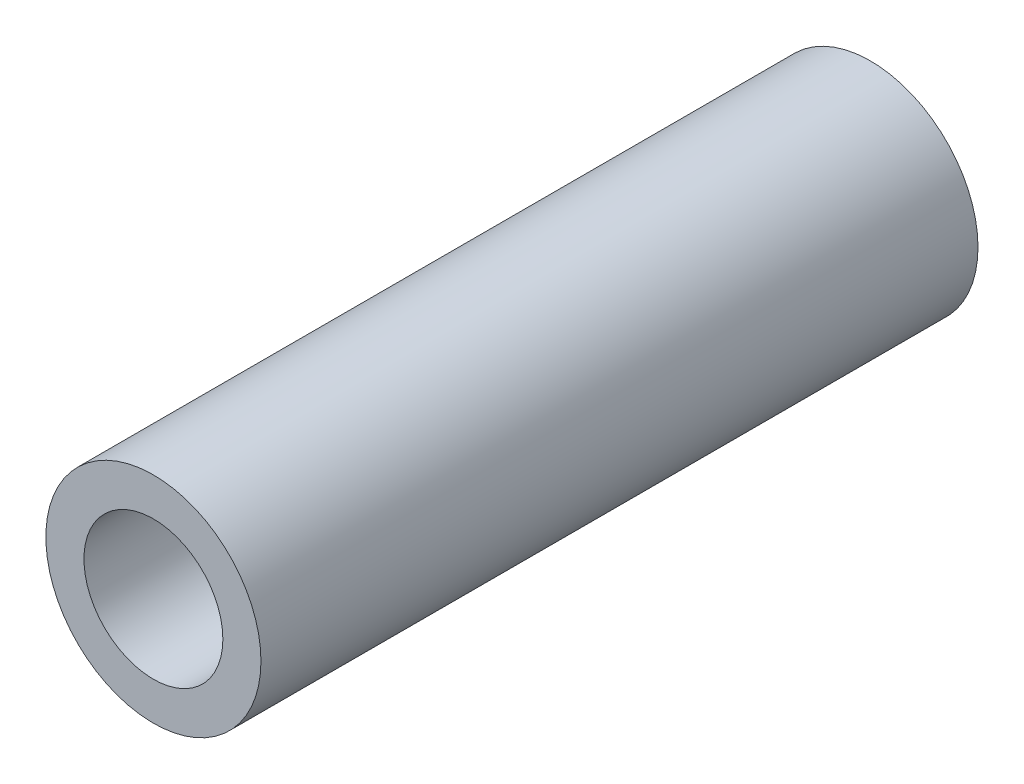
ISO-10303-21;
HEADER;
FILE_DESCRIPTION(('STEP AP214'),'2;1');
FILE_NAME('part.step','',(''),(''),'','','');
FILE_SCHEMA(('AUTOMOTIVE_DESIGN { 1 0 10303 214 1 1 1 1 }'));
ENDSEC;
DATA;
#1=APPLICATION_CONTEXT('core data for automotive mechanical design processes');
#2=APPLICATION_PROTOCOL_DEFINITION('international standard','automotive_design',2000,#1);
#3=PRODUCT_CONTEXT('',#1,'mechanical');
#4=PRODUCT('Part','Part','',(#3));
#5=PRODUCT_RELATED_PRODUCT_CATEGORY('part','',(#4));
#6=PRODUCT_DEFINITION_FORMATION('','',#4);
#7=PRODUCT_DEFINITION_CONTEXT('part definition',#1,'design');
#8=PRODUCT_DEFINITION('design','',#6,#7);
#9=PRODUCT_DEFINITION_SHAPE('','',#8);
#10=(LENGTH_UNIT() NAMED_UNIT(*) SI_UNIT(.MILLI.,.METRE.));
#11=(NAMED_UNIT(*) PLANE_ANGLE_UNIT() SI_UNIT($,.RADIAN.));
#12=(NAMED_UNIT(*) SI_UNIT($,.STERADIAN.) SOLID_ANGLE_UNIT());
#13=UNCERTAINTY_MEASURE_WITH_UNIT(LENGTH_MEASURE(1.E-05),#10,'distance_accuracy_value','');
#14=(GEOMETRIC_REPRESENTATION_CONTEXT(3) GLOBAL_UNCERTAINTY_ASSIGNED_CONTEXT((#13)) GLOBAL_UNIT_ASSIGNED_CONTEXT((#10,
#11,#12)) REPRESENTATION_CONTEXT('',''));
#15=CARTESIAN_POINT('',(0.,0.,0.));
#16=DIRECTION('',(0.,0.,1.));
#17=DIRECTION('',(1.,0.,0.));
#18=AXIS2_PLACEMENT_3D('',#15,#16,#17);
#19=CARTESIAN_POINT('',(-33.8929901882352,10.6703116736639,16.));
#20=DIRECTION('',(0.,0.,1.));
#21=DIRECTION('',(1.,0.,0.));
#22=AXIS2_PLACEMENT_3D('',#19,#20,#21);
#23=PLANE('',#22);
#24=CARTESIAN_POINT('',(-33.8929901882352,10.6703116736639,16.));
#25=DIRECTION('',(0.,0.,1.));
#26=DIRECTION('',(1.,0.,0.));
#27=AXIS2_PLACEMENT_3D('',#24,#25,#26);
#28=CIRCLE('',#27,2.4);
#29=CARTESIAN_POINT('',(-31.4929901882352,10.6703116736639,16.));
#30=VERTEX_POINT('',#29);
#31=EDGE_CURVE('E10',#30,#30,#28,.T.);
#32=ORIENTED_EDGE('',*,*,#31,.T.);
#33=EDGE_LOOP('',(#32));
#34=FACE_BOUND('',#33,.T.);
#35=CARTESIAN_POINT('',(-33.8929901882352,10.6703116736639,16.));
#36=DIRECTION('',(0.,0.,1.));
#37=DIRECTION('',(1.,0.,0.));
#38=AXIS2_PLACEMENT_3D('',#35,#36,#37);
#39=CIRCLE('',#38,1.55);
#40=CARTESIAN_POINT('',(-32.3429901882352,10.6703116736639,16.));
#41=VERTEX_POINT('',#40);
#42=EDGE_CURVE('E50',#41,#41,#39,.T.);
#43=ORIENTED_EDGE('',*,*,#42,.F.);
#44=EDGE_LOOP('',(#43));
#45=FACE_BOUND('',#44,.T.);
#46=ADVANCED_FACE('F37',(#34,#45),#23,.T.);
#47=CARTESIAN_POINT('',(-33.8929901882352,10.6703116736639,0.));
#48=DIRECTION('',(0.,0.,1.));
#49=DIRECTION('',(1.,0.,0.));
#50=AXIS2_PLACEMENT_3D('',#47,#48,#49);
#51=PLANE('',#50);
#52=CARTESIAN_POINT('',(-33.8929901882352,10.6703116736639,0.));
#53=DIRECTION('',(0.,0.,1.));
#54=DIRECTION('',(1.,0.,0.));
#55=AXIS2_PLACEMENT_3D('',#52,#53,#54);
#56=CIRCLE('',#55,2.4);
#57=CARTESIAN_POINT('',(-31.4929901882352,10.6703116736639,0.));
#58=VERTEX_POINT('',#57);
#59=EDGE_CURVE('E41',#58,#58,#56,.T.);
#60=ORIENTED_EDGE('',*,*,#59,.F.);
#61=EDGE_LOOP('',(#60));
#62=FACE_BOUND('',#61,.T.);
#63=CARTESIAN_POINT('',(-33.8929901882352,10.6703116736639,0.));
#64=DIRECTION('',(0.,0.,1.));
#65=DIRECTION('',(1.,0.,0.));
#66=AXIS2_PLACEMENT_3D('',#63,#64,#65);
#67=CIRCLE('',#66,1.55);
#68=CARTESIAN_POINT('',(-32.3429901882352,10.6703116736639,0.));
#69=VERTEX_POINT('',#68);
#70=EDGE_CURVE('E52',#69,#69,#67,.T.);
#71=ORIENTED_EDGE('',*,*,#70,.T.);
#72=EDGE_LOOP('',(#71));
#73=FACE_BOUND('',#72,.T.);
#74=ADVANCED_FACE('F64',(#62,#73),#51,.F.);
#75=CARTESIAN_POINT('',(-33.8929901882352,10.6703116736639,16.));
#76=DIRECTION('',(0.,0.,-1.));
#77=DIRECTION('',(-1.,0.,0.));
#78=AXIS2_PLACEMENT_3D('',#75,#76,#77);
#79=CYLINDRICAL_SURFACE('',#78,2.4);
#80=ORIENTED_EDGE('',*,*,#31,.F.);
#81=EDGE_LOOP('',(#80));
#82=FACE_BOUND('',#81,.T.);
#83=ORIENTED_EDGE('',*,*,#59,.T.);
#84=EDGE_LOOP('',(#83));
#85=FACE_BOUND('',#84,.T.);
#86=ADVANCED_FACE('F39',(#82,#85),#79,.T.);
#87=CARTESIAN_POINT('',(-33.8929901882352,10.6703116736639,16.));
#88=DIRECTION('',(0.,0.,-1.));
#89=DIRECTION('',(-1.,0.,0.));
#90=AXIS2_PLACEMENT_3D('',#87,#88,#89);
#91=CYLINDRICAL_SURFACE('',#90,1.55);
#92=ORIENTED_EDGE('',*,*,#42,.T.);
#93=EDGE_LOOP('',(#92));
#94=FACE_BOUND('',#93,.T.);
#95=ORIENTED_EDGE('',*,*,#70,.F.);
#96=EDGE_LOOP('',(#95));
#97=FACE_BOUND('',#96,.T.);
#98=ADVANCED_FACE('F60',(#94,#97),#91,.F.);
#99=CLOSED_SHELL('',(#46,#74,#86,#98));
#100=MANIFOLD_SOLID_BREP('B2',#99);
#101=ADVANCED_BREP_SHAPE_REPRESENTATION('',(#18,#100),#14);
#102=SHAPE_DEFINITION_REPRESENTATION(#9,#101);
ENDSEC;
END-ISO-10303-21;
